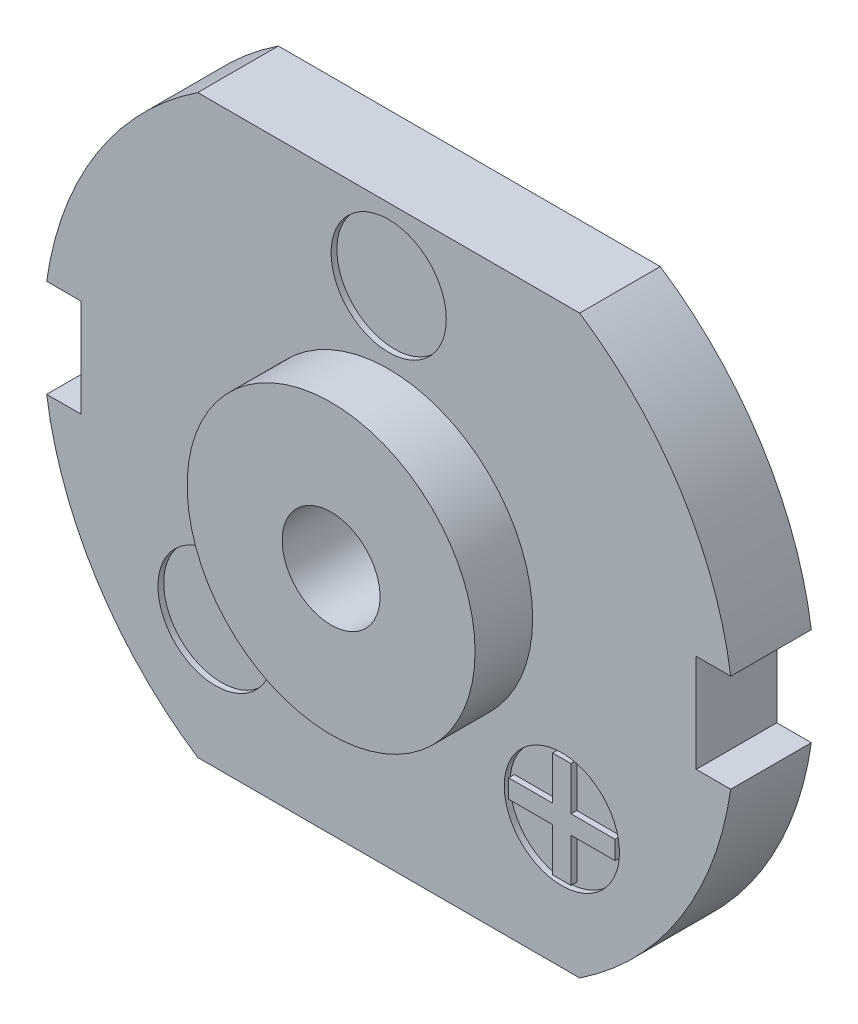
ISO-10303-21;
HEADER;
FILE_DESCRIPTION(('STEP AP214'),'2;1');
FILE_NAME('part.step','',(''),(''),'','','');
FILE_SCHEMA(('AUTOMOTIVE_DESIGN { 1 0 10303 214 1 1 1 1 }'));
ENDSEC;
DATA;
#1=APPLICATION_CONTEXT('core data for automotive mechanical design processes');
#2=APPLICATION_PROTOCOL_DEFINITION('international standard','automotive_design',2000,#1);
#3=PRODUCT_CONTEXT('',#1,'mechanical');
#4=PRODUCT('Part','Part','',(#3));
#5=PRODUCT_RELATED_PRODUCT_CATEGORY('part','',(#4));
#6=PRODUCT_DEFINITION_FORMATION('','',#4);
#7=PRODUCT_DEFINITION_CONTEXT('part definition',#1,'design');
#8=PRODUCT_DEFINITION('design','',#6,#7);
#9=PRODUCT_DEFINITION_SHAPE('','',#8);
#10=(LENGTH_UNIT() NAMED_UNIT(*) SI_UNIT(.MILLI.,.METRE.));
#11=(NAMED_UNIT(*) PLANE_ANGLE_UNIT() SI_UNIT($,.RADIAN.));
#12=(NAMED_UNIT(*) SI_UNIT($,.STERADIAN.) SOLID_ANGLE_UNIT());
#13=UNCERTAINTY_MEASURE_WITH_UNIT(LENGTH_MEASURE(1.E-05),#10,'distance_accuracy_value','');
#14=(GEOMETRIC_REPRESENTATION_CONTEXT(3) GLOBAL_UNCERTAINTY_ASSIGNED_CONTEXT((#13)) GLOBAL_UNIT_ASSIGNED_CONTEXT((#10,
#11,#12)) REPRESENTATION_CONTEXT('',''));
#15=CARTESIAN_POINT('',(0.,0.,0.));
#16=DIRECTION('',(0.,0.,1.));
#17=DIRECTION('',(1.,0.,0.));
#18=AXIS2_PLACEMENT_3D('',#15,#16,#17);
#19=CARTESIAN_POINT('',(0.,0.,1.4));
#20=DIRECTION('',(0.,0.,1.));
#21=DIRECTION('',(1.,0.,0.));
#22=AXIS2_PLACEMENT_3D('',#19,#20,#21);
#23=PLANE('',#22);
#24=CARTESIAN_POINT('',(0.,3.75,1.4));
#25=DIRECTION('',(0.,0.,1.));
#26=DIRECTION('',(1.,0.,0.));
#27=AXIS2_PLACEMENT_3D('',#24,#25,#26);
#28=CIRCLE('',#27,1.);
#29=CARTESIAN_POINT('',(1.,3.75,1.4));
#30=VERTEX_POINT('',#29);
#31=EDGE_CURVE('E388',#30,#30,#28,.T.);
#32=ORIENTED_EDGE('',*,*,#31,.F.);
#33=EDGE_LOOP('',(#32));
#34=FACE_BOUND('',#33,.T.);
#35=CARTESIAN_POINT('',(3.00665339511067,-2.76689870627636,1.4));
#36=DIRECTION('',(0.,0.,1.));
#37=DIRECTION('',(-1.,0.,0.));
#38=AXIS2_PLACEMENT_3D('',#35,#36,#37);
#39=CIRCLE('',#38,1.);
#40=CARTESIAN_POINT('',(2.00665339511067,-2.76689870627636,1.4));
#41=VERTEX_POINT('',#40);
#42=EDGE_CURVE('E278',#41,#41,#39,.T.);
#43=ORIENTED_EDGE('',*,*,#42,.F.);
#44=EDGE_LOOP('',(#43));
#45=FACE_BOUND('',#44,.T.);
#46=CARTESIAN_POINT('',(-3.00665339511067,-2.76689870627636,1.4));
#47=DIRECTION('',(0.,0.,1.));
#48=DIRECTION('',(1.,0.,0.));
#49=AXIS2_PLACEMENT_3D('',#46,#47,#48);
#50=CIRCLE('',#49,1.);
#51=CARTESIAN_POINT('',(-2.00665339511067,-2.76689870627636,1.4));
#52=VERTEX_POINT('',#51);
#53=EDGE_CURVE('E272',#52,#52,#50,.T.);
#54=ORIENTED_EDGE('',*,*,#53,.F.);
#55=EDGE_LOOP('',(#54));
#56=FACE_BOUND('',#55,.T.);
#57=CARTESIAN_POINT('',(0.,0.,1.4));
#58=DIRECTION('',(0.,0.,1.));
#59=DIRECTION('',(1.,0.,0.));
#60=AXIS2_PLACEMENT_3D('',#57,#58,#59);
#61=CIRCLE('',#60,6.);
#62=CARTESIAN_POINT('',(-5.9394865097919,-0.850000000000001,1.4));
#63=VERTEX_POINT('',#62);
#64=CARTESIAN_POINT('',(-3.31662479035541,-5.,1.4));
#65=VERTEX_POINT('',#64);
#66=EDGE_CURVE('E188',#63,#65,#61,.T.);
#67=ORIENTED_EDGE('',*,*,#66,.T.);
#68=DIRECTION('',(1.,0.,0.));
#69=VECTOR('',#68,1.);
#70=CARTESIAN_POINT('',(-3.31662479035541,-5.,1.4));
#71=LINE('',#70,#69);
#72=CARTESIAN_POINT('',(3.3166247903554,-5.,1.4));
#73=VERTEX_POINT('',#72);
#74=EDGE_CURVE('E109',#65,#73,#71,.T.);
#75=ORIENTED_EDGE('',*,*,#74,.T.);
#76=CARTESIAN_POINT('',(0.,0.,1.4));
#77=DIRECTION('',(0.,0.,1.));
#78=DIRECTION('',(1.,0.,0.));
#79=AXIS2_PLACEMENT_3D('',#76,#77,#78);
#80=CIRCLE('',#79,6.);
#81=CARTESIAN_POINT('',(5.93948650979191,-0.849999999999999,1.4));
#82=VERTEX_POINT('',#81);
#83=EDGE_CURVE('E215',#73,#82,#80,.T.);
#84=ORIENTED_EDGE('',*,*,#83,.T.);
#85=DIRECTION('',(-1.,0.,0.));
#86=VECTOR('',#85,1.);
#87=CARTESIAN_POINT('',(5.93948650979191,-0.849999999999999,1.4));
#88=LINE('',#87,#86);
#89=CARTESIAN_POINT('',(5.3404104146324,-0.849999999999999,1.4));
#90=VERTEX_POINT('',#89);
#91=EDGE_CURVE('E234',#82,#90,#88,.T.);
#92=ORIENTED_EDGE('',*,*,#91,.T.);
#93=DIRECTION('',(0.,1.,0.));
#94=VECTOR('',#93,1.);
#95=CARTESIAN_POINT('',(5.3404104146324,-0.849999999999999,1.4));
#96=LINE('',#95,#94);
#97=CARTESIAN_POINT('',(5.3404104146324,0.849999999999999,1.4));
#98=VERTEX_POINT('',#97);
#99=EDGE_CURVE('E231',#90,#98,#96,.T.);
#100=ORIENTED_EDGE('',*,*,#99,.T.);
#101=DIRECTION('',(1.,0.,0.));
#102=VECTOR('',#101,1.);
#103=CARTESIAN_POINT('',(5.93948650979191,0.85,1.4));
#104=LINE('',#103,#102);
#105=CARTESIAN_POINT('',(5.93948650979191,0.85,1.4));
#106=VERTEX_POINT('',#105);
#107=EDGE_CURVE('E233',#98,#106,#104,.T.);
#108=ORIENTED_EDGE('',*,*,#107,.T.);
#109=CARTESIAN_POINT('',(0.,0.,1.4));
#110=DIRECTION('',(0.,0.,1.));
#111=DIRECTION('',(1.,0.,0.));
#112=AXIS2_PLACEMENT_3D('',#109,#110,#111);
#113=CIRCLE('',#112,6.);
#114=CARTESIAN_POINT('',(3.3166247903554,5.,1.4));
#115=VERTEX_POINT('',#114);
#116=EDGE_CURVE('E236',#106,#115,#113,.T.);
#117=ORIENTED_EDGE('',*,*,#116,.T.);
#118=DIRECTION('',(-1.,0.,0.));
#119=VECTOR('',#118,1.);
#120=CARTESIAN_POINT('',(3.3166247903554,5.,1.4));
#121=LINE('',#120,#119);
#122=CARTESIAN_POINT('',(-3.3166247903554,5.,1.4));
#123=VERTEX_POINT('',#122);
#124=EDGE_CURVE('E242',#115,#123,#121,.T.);
#125=ORIENTED_EDGE('',*,*,#124,.T.);
#126=CARTESIAN_POINT('',(0.,0.,1.4));
#127=DIRECTION('',(0.,0.,1.));
#128=DIRECTION('',(1.,0.,0.));
#129=AXIS2_PLACEMENT_3D('',#126,#127,#128);
#130=CIRCLE('',#129,6.);
#131=CARTESIAN_POINT('',(-5.9394865097919,0.849999999999999,1.4));
#132=VERTEX_POINT('',#131);
#133=EDGE_CURVE('E143',#123,#132,#130,.T.);
#134=ORIENTED_EDGE('',*,*,#133,.T.);
#135=DIRECTION('',(1.,0.,0.));
#136=VECTOR('',#135,1.);
#137=CARTESIAN_POINT('',(-5.3404104146324,0.849999999999999,1.4));
#138=LINE('',#137,#136);
#139=CARTESIAN_POINT('',(-5.3404104146324,0.849999999999999,1.4));
#140=VERTEX_POINT('',#139);
#141=EDGE_CURVE('E136',#132,#140,#138,.T.);
#142=ORIENTED_EDGE('',*,*,#141,.T.);
#143=DIRECTION('',(0.,-1.,0.));
#144=VECTOR('',#143,1.);
#145=CARTESIAN_POINT('',(-5.3404104146324,-0.849999999999999,1.4));
#146=LINE('',#145,#144);
#147=CARTESIAN_POINT('',(-5.3404104146324,-0.849999999999999,1.4));
#148=VERTEX_POINT('',#147);
#149=EDGE_CURVE('E140',#140,#148,#146,.T.);
#150=ORIENTED_EDGE('',*,*,#149,.T.);
#151=DIRECTION('',(-1.,0.,0.));
#152=VECTOR('',#151,1.);
#153=CARTESIAN_POINT('',(-5.3404104146324,-0.849999999999999,1.4));
#154=LINE('',#153,#152);
#155=EDGE_CURVE('E56',#148,#63,#154,.T.);
#156=ORIENTED_EDGE('',*,*,#155,.T.);
#157=EDGE_LOOP('',(#67,#75,#84,#92,#100,#108,#117,#125,#134,#142,#150,#156));
#158=FACE_BOUND('',#157,.T.);
#159=CARTESIAN_POINT('',(0.,0.,1.4));
#160=DIRECTION('',(0.,0.,1.));
#161=DIRECTION('',(1.,0.,0.));
#162=AXIS2_PLACEMENT_3D('',#159,#160,#161);
#163=CIRCLE('',#162,2.5);
#164=CARTESIAN_POINT('',(2.5,0.,1.4));
#165=VERTEX_POINT('',#164);
#166=EDGE_CURVE('E263',#165,#165,#163,.T.);
#167=ORIENTED_EDGE('',*,*,#166,.F.);
#168=EDGE_LOOP('',(#167));
#169=FACE_BOUND('',#168,.T.);
#170=ADVANCED_FACE('F32',(#34,#45,#56,#158,#169),#23,.T.);
#171=CARTESIAN_POINT('',(0.,0.,0.));
#172=DIRECTION('',(0.,0.,1.));
#173=DIRECTION('',(1.,0.,0.));
#174=AXIS2_PLACEMENT_3D('',#171,#172,#173);
#175=PLANE('',#174);
#176=CARTESIAN_POINT('',(0.,0.,0.));
#177=DIRECTION('',(0.,0.,1.));
#178=DIRECTION('',(1.,0.,0.));
#179=AXIS2_PLACEMENT_3D('',#176,#177,#178);
#180=CIRCLE('',#179,6.);
#181=CARTESIAN_POINT('',(-5.9394865097919,-0.850000000000001,0.));
#182=VERTEX_POINT('',#181);
#183=CARTESIAN_POINT('',(-3.31662479035541,-5.,0.));
#184=VERTEX_POINT('',#183);
#185=EDGE_CURVE('E164',#182,#184,#180,.T.);
#186=ORIENTED_EDGE('',*,*,#185,.F.);
#187=DIRECTION('',(-1.,0.,0.));
#188=VECTOR('',#187,1.);
#189=CARTESIAN_POINT('',(-5.3404104146324,-0.849999999999999,0.));
#190=LINE('',#189,#188);
#191=CARTESIAN_POINT('',(-5.3404104146324,-0.849999999999999,0.));
#192=VERTEX_POINT('',#191);
#193=EDGE_CURVE('E101',#192,#182,#190,.T.);
#194=ORIENTED_EDGE('',*,*,#193,.F.);
#195=DIRECTION('',(0.,-1.,0.));
#196=VECTOR('',#195,1.);
#197=CARTESIAN_POINT('',(-5.3404104146324,-0.849999999999999,0.));
#198=LINE('',#197,#196);
#199=CARTESIAN_POINT('',(-5.3404104146324,0.849999999999999,0.));
#200=VERTEX_POINT('',#199);
#201=EDGE_CURVE('E185',#200,#192,#198,.T.);
#202=ORIENTED_EDGE('',*,*,#201,.F.);
#203=DIRECTION('',(1.,0.,0.));
#204=VECTOR('',#203,1.);
#205=CARTESIAN_POINT('',(-5.3404104146324,0.849999999999999,0.));
#206=LINE('',#205,#204);
#207=CARTESIAN_POINT('',(-5.9394865097919,0.849999999999999,0.));
#208=VERTEX_POINT('',#207);
#209=EDGE_CURVE('E152',#208,#200,#206,.T.);
#210=ORIENTED_EDGE('',*,*,#209,.F.);
#211=CARTESIAN_POINT('',(0.,0.,0.));
#212=DIRECTION('',(0.,0.,1.));
#213=DIRECTION('',(1.,0.,0.));
#214=AXIS2_PLACEMENT_3D('',#211,#212,#213);
#215=CIRCLE('',#214,6.);
#216=CARTESIAN_POINT('',(-3.3166247903554,5.,0.));
#217=VERTEX_POINT('',#216);
#218=EDGE_CURVE('E182',#217,#208,#215,.T.);
#219=ORIENTED_EDGE('',*,*,#218,.F.);
#220=DIRECTION('',(-1.,0.,0.));
#221=VECTOR('',#220,1.);
#222=CARTESIAN_POINT('',(3.3166247903554,5.,0.));
#223=LINE('',#222,#221);
#224=CARTESIAN_POINT('',(3.3166247903554,5.,0.));
#225=VERTEX_POINT('',#224);
#226=EDGE_CURVE('E180',#225,#217,#223,.T.);
#227=ORIENTED_EDGE('',*,*,#226,.F.);
#228=CARTESIAN_POINT('',(0.,0.,0.));
#229=DIRECTION('',(0.,0.,1.));
#230=DIRECTION('',(1.,0.,0.));
#231=AXIS2_PLACEMENT_3D('',#228,#229,#230);
#232=CIRCLE('',#231,6.);
#233=CARTESIAN_POINT('',(5.93948650979191,0.85,0.));
#234=VERTEX_POINT('',#233);
#235=EDGE_CURVE('E178',#234,#225,#232,.T.);
#236=ORIENTED_EDGE('',*,*,#235,.F.);
#237=DIRECTION('',(1.,0.,0.));
#238=VECTOR('',#237,1.);
#239=CARTESIAN_POINT('',(5.93948650979191,0.85,0.));
#240=LINE('',#239,#238);
#241=CARTESIAN_POINT('',(5.3404104146324,0.849999999999999,0.));
#242=VERTEX_POINT('',#241);
#243=EDGE_CURVE('E176',#242,#234,#240,.T.);
#244=ORIENTED_EDGE('',*,*,#243,.F.);
#245=DIRECTION('',(0.,1.,0.));
#246=VECTOR('',#245,1.);
#247=CARTESIAN_POINT('',(5.3404104146324,-0.849999999999999,0.));
#248=LINE('',#247,#246);
#249=CARTESIAN_POINT('',(5.3404104146324,-0.849999999999999,0.));
#250=VERTEX_POINT('',#249);
#251=EDGE_CURVE('E174',#250,#242,#248,.T.);
#252=ORIENTED_EDGE('',*,*,#251,.F.);
#253=DIRECTION('',(-1.,0.,0.));
#254=VECTOR('',#253,1.);
#255=CARTESIAN_POINT('',(5.93948650979191,-0.849999999999999,0.));
#256=LINE('',#255,#254);
#257=CARTESIAN_POINT('',(5.93948650979191,-0.849999999999999,0.));
#258=VERTEX_POINT('',#257);
#259=EDGE_CURVE('E172',#258,#250,#256,.T.);
#260=ORIENTED_EDGE('',*,*,#259,.F.);
#261=CARTESIAN_POINT('',(0.,0.,0.));
#262=DIRECTION('',(0.,0.,1.));
#263=DIRECTION('',(1.,0.,0.));
#264=AXIS2_PLACEMENT_3D('',#261,#262,#263);
#265=CIRCLE('',#264,6.);
#266=CARTESIAN_POINT('',(3.3166247903554,-5.,0.));
#267=VERTEX_POINT('',#266);
#268=EDGE_CURVE('E170',#267,#258,#265,.T.);
#269=ORIENTED_EDGE('',*,*,#268,.F.);
#270=DIRECTION('',(1.,0.,0.));
#271=VECTOR('',#270,1.);
#272=CARTESIAN_POINT('',(-3.31662479035541,-5.,0.));
#273=LINE('',#272,#271);
#274=EDGE_CURVE('E167',#184,#267,#273,.T.);
#275=ORIENTED_EDGE('',*,*,#274,.F.);
#276=EDGE_LOOP('',(#186,#194,#202,#210,#219,#227,#236,#244,#252,#260,#269,#275));
#277=FACE_BOUND('',#276,.T.);
#278=CARTESIAN_POINT('',(0.,0.,0.));
#279=DIRECTION('',(0.,0.,1.));
#280=DIRECTION('',(1.,0.,0.));
#281=AXIS2_PLACEMENT_3D('',#278,#279,#280);
#282=CIRCLE('',#281,0.85);
#283=CARTESIAN_POINT('',(0.85,0.,0.));
#284=VERTEX_POINT('',#283);
#285=EDGE_CURVE('E168',#284,#284,#282,.T.);
#286=ORIENTED_EDGE('',*,*,#285,.T.);
#287=EDGE_LOOP('',(#286));
#288=FACE_BOUND('',#287,.T.);
#289=ADVANCED_FACE('F219',(#277,#288),#175,.F.);
#290=CARTESIAN_POINT('',(0.,0.,1.4));
#291=DIRECTION('',(0.,0.,-1.));
#292=DIRECTION('',(-1.,0.,0.));
#293=AXIS2_PLACEMENT_3D('',#290,#291,#292);
#294=CYLINDRICAL_SURFACE('',#293,6.);
#295=ORIENTED_EDGE('',*,*,#185,.T.);
#296=DIRECTION('',(0.,0.,-1.));
#297=VECTOR('',#296,1.);
#298=CARTESIAN_POINT('',(-3.31662479035541,-5.,1.4));
#299=LINE('',#298,#297);
#300=EDGE_CURVE('E11',#65,#184,#299,.T.);
#301=ORIENTED_EDGE('',*,*,#300,.F.);
#302=ORIENTED_EDGE('',*,*,#66,.F.);
#303=DIRECTION('',(0.,0.,-1.));
#304=VECTOR('',#303,1.);
#305=CARTESIAN_POINT('',(-5.9394865097919,-0.850000000000001,1.4));
#306=LINE('',#305,#304);
#307=EDGE_CURVE('E160',#63,#182,#306,.T.);
#308=ORIENTED_EDGE('',*,*,#307,.T.);
#309=EDGE_LOOP('',(#295,#301,#302,#308));
#310=FACE_BOUND('',#309,.T.);
#311=ADVANCED_FACE('F34',(#310),#294,.T.);
#312=CARTESIAN_POINT('',(-3.31662479035541,-5.,1.4));
#313=DIRECTION('',(0.,1.,0.));
#314=DIRECTION('',(-1.,0.,0.));
#315=AXIS2_PLACEMENT_3D('',#312,#313,#314);
#316=PLANE('',#315);
#317=ORIENTED_EDGE('',*,*,#274,.T.);
#318=DIRECTION('',(0.,0.,-1.));
#319=VECTOR('',#318,1.);
#320=CARTESIAN_POINT('',(3.3166247903554,-5.,1.4));
#321=LINE('',#320,#319);
#322=EDGE_CURVE('E40',#73,#267,#321,.T.);
#323=ORIENTED_EDGE('',*,*,#322,.F.);
#324=ORIENTED_EDGE('',*,*,#74,.F.);
#325=ORIENTED_EDGE('',*,*,#300,.T.);
#326=EDGE_LOOP('',(#317,#323,#324,#325));
#327=FACE_BOUND('',#326,.T.);
#328=ADVANCED_FACE('F461',(#327),#316,.F.);
#329=CARTESIAN_POINT('',(0.,0.,1.4));
#330=DIRECTION('',(0.,0.,-1.));
#331=DIRECTION('',(-1.,0.,0.));
#332=AXIS2_PLACEMENT_3D('',#329,#330,#331);
#333=CYLINDRICAL_SURFACE('',#332,6.);
#334=ORIENTED_EDGE('',*,*,#268,.T.);
#335=DIRECTION('',(0.,0.,-1.));
#336=VECTOR('',#335,1.);
#337=CARTESIAN_POINT('',(5.93948650979191,-0.849999999999999,1.4));
#338=LINE('',#337,#336);
#339=EDGE_CURVE('E207',#82,#258,#338,.T.);
#340=ORIENTED_EDGE('',*,*,#339,.F.);
#341=ORIENTED_EDGE('',*,*,#83,.F.);
#342=ORIENTED_EDGE('',*,*,#322,.T.);
#343=EDGE_LOOP('',(#334,#340,#341,#342));
#344=FACE_BOUND('',#343,.T.);
#345=ADVANCED_FACE('F213',(#344),#333,.T.);
#346=CARTESIAN_POINT('',(5.93948650979191,-0.849999999999999,1.4));
#347=DIRECTION('',(0.,-1.,0.));
#348=DIRECTION('',(1.,0.,0.));
#349=AXIS2_PLACEMENT_3D('',#346,#347,#348);
#350=PLANE('',#349);
#351=ORIENTED_EDGE('',*,*,#259,.T.);
#352=DIRECTION('',(0.,0.,-1.));
#353=VECTOR('',#352,1.);
#354=CARTESIAN_POINT('',(5.3404104146324,-0.849999999999999,1.4));
#355=LINE('',#354,#353);
#356=EDGE_CURVE('E204',#90,#250,#355,.T.);
#357=ORIENTED_EDGE('',*,*,#356,.F.);
#358=ORIENTED_EDGE('',*,*,#91,.F.);
#359=ORIENTED_EDGE('',*,*,#339,.T.);
#360=EDGE_LOOP('',(#351,#357,#358,#359));
#361=FACE_BOUND('',#360,.T.);
#362=ADVANCED_FACE('F225',(#361),#350,.F.);
#363=CARTESIAN_POINT('',(5.3404104146324,-0.849999999999999,1.4));
#364=DIRECTION('',(-1.,0.,0.));
#365=DIRECTION('',(0.,0.,1.));
#366=AXIS2_PLACEMENT_3D('',#363,#364,#365);
#367=PLANE('',#366);
#368=ORIENTED_EDGE('',*,*,#251,.T.);
#369=DIRECTION('',(0.,0.,-1.));
#370=VECTOR('',#369,1.);
#371=CARTESIAN_POINT('',(5.3404104146324,0.849999999999999,1.4));
#372=LINE('',#371,#370);
#373=EDGE_CURVE('E201',#98,#242,#372,.T.);
#374=ORIENTED_EDGE('',*,*,#373,.F.);
#375=ORIENTED_EDGE('',*,*,#99,.F.);
#376=ORIENTED_EDGE('',*,*,#356,.T.);
#377=EDGE_LOOP('',(#368,#374,#375,#376));
#378=FACE_BOUND('',#377,.T.);
#379=ADVANCED_FACE('F229',(#378),#367,.F.);
#380=CARTESIAN_POINT('',(5.93948650979191,0.85,1.4));
#381=DIRECTION('',(0.,1.,0.));
#382=DIRECTION('',(-1.,0.,0.));
#383=AXIS2_PLACEMENT_3D('',#380,#381,#382);
#384=PLANE('',#383);
#385=ORIENTED_EDGE('',*,*,#243,.T.);
#386=DIRECTION('',(0.,0.,-1.));
#387=VECTOR('',#386,1.);
#388=CARTESIAN_POINT('',(5.93948650979191,0.85,1.4));
#389=LINE('',#388,#387);
#390=EDGE_CURVE('E198',#106,#234,#389,.T.);
#391=ORIENTED_EDGE('',*,*,#390,.F.);
#392=ORIENTED_EDGE('',*,*,#107,.F.);
#393=ORIENTED_EDGE('',*,*,#373,.T.);
#394=EDGE_LOOP('',(#385,#391,#392,#393));
#395=FACE_BOUND('',#394,.T.);
#396=ADVANCED_FACE('F451',(#395),#384,.F.);
#397=CARTESIAN_POINT('',(0.,0.,1.4));
#398=DIRECTION('',(0.,0.,-1.));
#399=DIRECTION('',(-1.,0.,0.));
#400=AXIS2_PLACEMENT_3D('',#397,#398,#399);
#401=CYLINDRICAL_SURFACE('',#400,6.);
#402=ORIENTED_EDGE('',*,*,#235,.T.);
#403=DIRECTION('',(0.,0.,-1.));
#404=VECTOR('',#403,1.);
#405=CARTESIAN_POINT('',(3.3166247903554,5.,1.4));
#406=LINE('',#405,#404);
#407=EDGE_CURVE('E195',#115,#225,#406,.T.);
#408=ORIENTED_EDGE('',*,*,#407,.F.);
#409=ORIENTED_EDGE('',*,*,#116,.F.);
#410=ORIENTED_EDGE('',*,*,#390,.T.);
#411=EDGE_LOOP('',(#402,#408,#409,#410));
#412=FACE_BOUND('',#411,.T.);
#413=ADVANCED_FACE('F448',(#412),#401,.T.);
#414=CARTESIAN_POINT('',(3.3166247903554,5.,1.4));
#415=DIRECTION('',(0.,-1.,0.));
#416=DIRECTION('',(1.,0.,0.));
#417=AXIS2_PLACEMENT_3D('',#414,#415,#416);
#418=PLANE('',#417);
#419=ORIENTED_EDGE('',*,*,#226,.T.);
#420=DIRECTION('',(0.,0.,-1.));
#421=VECTOR('',#420,1.);
#422=CARTESIAN_POINT('',(-3.3166247903554,5.,1.4));
#423=LINE('',#422,#421);
#424=EDGE_CURVE('E192',#123,#217,#423,.T.);
#425=ORIENTED_EDGE('',*,*,#424,.F.);
#426=ORIENTED_EDGE('',*,*,#124,.F.);
#427=ORIENTED_EDGE('',*,*,#407,.T.);
#428=EDGE_LOOP('',(#419,#425,#426,#427));
#429=FACE_BOUND('',#428,.T.);
#430=ADVANCED_FACE('F248',(#429),#418,.F.);
#431=CARTESIAN_POINT('',(0.,0.,1.4));
#432=DIRECTION('',(0.,0.,-1.));
#433=DIRECTION('',(-1.,0.,0.));
#434=AXIS2_PLACEMENT_3D('',#431,#432,#433);
#435=CYLINDRICAL_SURFACE('',#434,6.);
#436=ORIENTED_EDGE('',*,*,#218,.T.);
#437=DIRECTION('',(0.,0.,-1.));
#438=VECTOR('',#437,1.);
#439=CARTESIAN_POINT('',(-5.9394865097919,0.849999999999999,1.4));
#440=LINE('',#439,#438);
#441=EDGE_CURVE('E155',#132,#208,#440,.T.);
#442=ORIENTED_EDGE('',*,*,#441,.F.);
#443=ORIENTED_EDGE('',*,*,#133,.F.);
#444=ORIENTED_EDGE('',*,*,#424,.T.);
#445=EDGE_LOOP('',(#436,#442,#443,#444));
#446=FACE_BOUND('',#445,.T.);
#447=ADVANCED_FACE('F252',(#446),#435,.T.);
#448=CARTESIAN_POINT('',(-5.3404104146324,0.849999999999999,1.4));
#449=DIRECTION('',(0.,1.,0.));
#450=DIRECTION('',(-1.,0.,0.));
#451=AXIS2_PLACEMENT_3D('',#448,#449,#450);
#452=PLANE('',#451);
#453=ORIENTED_EDGE('',*,*,#209,.T.);
#454=DIRECTION('',(0.,0.,-1.));
#455=VECTOR('',#454,1.);
#456=CARTESIAN_POINT('',(-5.3404104146324,0.849999999999999,1.4));
#457=LINE('',#456,#455);
#458=EDGE_CURVE('E149',#140,#200,#457,.T.);
#459=ORIENTED_EDGE('',*,*,#458,.F.);
#460=ORIENTED_EDGE('',*,*,#141,.F.);
#461=ORIENTED_EDGE('',*,*,#441,.T.);
#462=EDGE_LOOP('',(#453,#459,#460,#461));
#463=FACE_BOUND('',#462,.T.);
#464=ADVANCED_FACE('F150',(#463),#452,.F.);
#465=CARTESIAN_POINT('',(-5.3404104146324,-0.849999999999999,1.4));
#466=DIRECTION('',(1.,0.,0.));
#467=DIRECTION('',(0.,0.,-1.));
#468=AXIS2_PLACEMENT_3D('',#465,#466,#467);
#469=PLANE('',#468);
#470=ORIENTED_EDGE('',*,*,#201,.T.);
#471=DIRECTION('',(0.,0.,-1.));
#472=VECTOR('',#471,1.);
#473=CARTESIAN_POINT('',(-5.3404104146324,-0.849999999999999,1.4));
#474=LINE('',#473,#472);
#475=EDGE_CURVE('E156',#148,#192,#474,.T.);
#476=ORIENTED_EDGE('',*,*,#475,.F.);
#477=ORIENTED_EDGE('',*,*,#149,.F.);
#478=ORIENTED_EDGE('',*,*,#458,.T.);
#479=EDGE_LOOP('',(#470,#476,#477,#478));
#480=FACE_BOUND('',#479,.T.);
#481=ADVANCED_FACE('F158',(#480),#469,.F.);
#482=CARTESIAN_POINT('',(-5.3404104146324,-0.849999999999999,1.4));
#483=DIRECTION('',(0.,-1.,0.));
#484=DIRECTION('',(1.,0.,0.));
#485=AXIS2_PLACEMENT_3D('',#482,#483,#484);
#486=PLANE('',#485);
#487=ORIENTED_EDGE('',*,*,#193,.T.);
#488=ORIENTED_EDGE('',*,*,#307,.F.);
#489=ORIENTED_EDGE('',*,*,#155,.F.);
#490=ORIENTED_EDGE('',*,*,#475,.T.);
#491=EDGE_LOOP('',(#487,#488,#489,#490));
#492=FACE_BOUND('',#491,.T.);
#493=ADVANCED_FACE('F253',(#492),#486,.F.);
#494=CARTESIAN_POINT('',(0.,0.,1.4));
#495=DIRECTION('',(0.,0.,-1.));
#496=DIRECTION('',(-1.,0.,0.));
#497=AXIS2_PLACEMENT_3D('',#494,#495,#496);
#498=CYLINDRICAL_SURFACE('',#497,0.85);
#499=ORIENTED_EDGE('',*,*,#285,.F.);
#500=EDGE_LOOP('',(#499));
#501=FACE_BOUND('',#500,.T.);
#502=CARTESIAN_POINT('',(0.,0.,2.4));
#503=DIRECTION('',(0.,0.,1.));
#504=DIRECTION('',(1.,0.,0.));
#505=AXIS2_PLACEMENT_3D('',#502,#503,#504);
#506=CIRCLE('',#505,0.85);
#507=CARTESIAN_POINT('',(0.85,0.,2.4));
#508=VERTEX_POINT('',#507);
#509=EDGE_CURVE('E266',#508,#508,#506,.T.);
#510=ORIENTED_EDGE('',*,*,#509,.T.);
#511=EDGE_LOOP('',(#510));
#512=FACE_BOUND('',#511,.T.);
#513=ADVANCED_FACE('F430',(#501,#512),#498,.F.);
#514=CARTESIAN_POINT('',(0.,0.,2.4));
#515=DIRECTION('',(0.,0.,1.));
#516=DIRECTION('',(1.,0.,0.));
#517=AXIS2_PLACEMENT_3D('',#514,#515,#516);
#518=PLANE('',#517);
#519=CARTESIAN_POINT('',(0.,0.,2.4));
#520=DIRECTION('',(0.,0.,1.));
#521=DIRECTION('',(1.,0.,0.));
#522=AXIS2_PLACEMENT_3D('',#519,#520,#521);
#523=CIRCLE('',#522,2.5);
#524=CARTESIAN_POINT('',(2.5,0.,2.4));
#525=VERTEX_POINT('',#524);
#526=EDGE_CURVE('E262',#525,#525,#523,.T.);
#527=ORIENTED_EDGE('',*,*,#526,.T.);
#528=EDGE_LOOP('',(#527));
#529=FACE_BOUND('',#528,.T.);
#530=ORIENTED_EDGE('',*,*,#509,.F.);
#531=EDGE_LOOP('',(#530));
#532=FACE_BOUND('',#531,.T.);
#533=ADVANCED_FACE('F423',(#529,#532),#518,.T.);
#534=CARTESIAN_POINT('',(0.,0.,2.4));
#535=DIRECTION('',(0.,0.,-1.));
#536=DIRECTION('',(-1.,0.,0.));
#537=AXIS2_PLACEMENT_3D('',#534,#535,#536);
#538=CYLINDRICAL_SURFACE('',#537,2.5);
#539=ORIENTED_EDGE('',*,*,#526,.F.);
#540=EDGE_LOOP('',(#539));
#541=FACE_BOUND('',#540,.T.);
#542=ORIENTED_EDGE('',*,*,#166,.T.);
#543=EDGE_LOOP('',(#542));
#544=FACE_BOUND('',#543,.T.);
#545=ADVANCED_FACE('F413',(#541,#544),#538,.T.);
#546=CARTESIAN_POINT('',(-3.00665339511067,-2.76689870627636,1.3));
#547=DIRECTION('',(0.,0.,1.));
#548=DIRECTION('',(1.,0.,0.));
#549=AXIS2_PLACEMENT_3D('',#546,#547,#548);
#550=CYLINDRICAL_SURFACE('',#549,1.);
#551=CARTESIAN_POINT('',(-3.00665339511067,-2.76689870627636,1.3));
#552=DIRECTION('',(0.,0.,1.));
#553=DIRECTION('',(1.,0.,0.));
#554=AXIS2_PLACEMENT_3D('',#551,#552,#553);
#555=CIRCLE('',#554,1.);
#556=CARTESIAN_POINT('',(-2.00665339511067,-2.76689870627636,1.3));
#557=VERTEX_POINT('',#556);
#558=EDGE_CURVE('E271',#557,#557,#555,.T.);
#559=ORIENTED_EDGE('',*,*,#558,.F.);
#560=EDGE_LOOP('',(#559));
#561=FACE_BOUND('',#560,.T.);
#562=ORIENTED_EDGE('',*,*,#53,.T.);
#563=EDGE_LOOP('',(#562));
#564=FACE_BOUND('',#563,.T.);
#565=ADVANCED_FACE('F410',(#561,#564),#550,.F.);
#566=CARTESIAN_POINT('',(-3.00665339511067,-2.76689870627636,1.3));
#567=DIRECTION('',(0.,0.,1.));
#568=DIRECTION('',(1.,0.,0.));
#569=AXIS2_PLACEMENT_3D('',#566,#567,#568);
#570=PLANE('',#569);
#571=ORIENTED_EDGE('',*,*,#558,.T.);
#572=EDGE_LOOP('',(#571));
#573=FACE_BOUND('',#572,.T.);
#574=ADVANCED_FACE('F412',(#573),#570,.T.);
#575=CARTESIAN_POINT('',(3.00665339511067,-2.76689870627636,1.3));
#576=DIRECTION('',(0.,0.,1.));
#577=DIRECTION('',(1.,0.,0.));
#578=AXIS2_PLACEMENT_3D('',#575,#576,#577);
#579=CYLINDRICAL_SURFACE('',#578,1.);
#580=CARTESIAN_POINT('',(3.00665339511067,-2.76689870627636,1.3));
#581=DIRECTION('',(0.,0.,1.));
#582=DIRECTION('',(-1.,0.,0.));
#583=AXIS2_PLACEMENT_3D('',#580,#581,#582);
#584=CIRCLE('',#583,1.);
#585=CARTESIAN_POINT('',(2.00665339511067,-2.76689870627636,1.3));
#586=VERTEX_POINT('',#585);
#587=EDGE_CURVE('E275',#586,#586,#584,.T.);
#588=ORIENTED_EDGE('',*,*,#587,.F.);
#589=EDGE_LOOP('',(#588));
#590=FACE_BOUND('',#589,.T.);
#591=ORIENTED_EDGE('',*,*,#42,.T.);
#592=EDGE_LOOP('',(#591));
#593=FACE_BOUND('',#592,.T.);
#594=ADVANCED_FACE('F420',(#590,#593),#579,.F.);
#595=CARTESIAN_POINT('',(3.00665339511067,-2.76689870627636,1.3));
#596=DIRECTION('',(0.,0.,-1.));
#597=DIRECTION('',(-1.,0.,0.));
#598=AXIS2_PLACEMENT_3D('',#595,#596,#597);
#599=PLANE('',#598);
#600=DIRECTION('',(0.,1.,0.));
#601=VECTOR('',#600,1.);
#602=CARTESIAN_POINT('',(3.16628165374625,-2.60599841136822,1.3));
#603=LINE('',#602,#601);
#604=CARTESIAN_POINT('',(3.16628165374625,-2.60599841136822,1.3));
#605=VERTEX_POINT('',#604);
#606=CARTESIAN_POINT('',(3.16628165374625,-1.85039599921935,1.3));
#607=VERTEX_POINT('',#606);
#608=EDGE_CURVE('E321',#605,#607,#603,.T.);
#609=ORIENTED_EDGE('',*,*,#608,.F.);
#610=DIRECTION('',(-1.,0.,0.));
#611=VECTOR('',#610,1.);
#612=CARTESIAN_POINT('',(3.16628165374625,-2.60599841136822,1.3));
#613=LINE('',#612,#611);
#614=CARTESIAN_POINT('',(3.9304594749993,-2.60599841136822,1.3));
#615=VERTEX_POINT('',#614);
#616=EDGE_CURVE('E288',#615,#605,#613,.T.);
#617=ORIENTED_EDGE('',*,*,#616,.F.);
#618=DIRECTION('',(0.,1.,0.));
#619=VECTOR('',#618,1.);
#620=CARTESIAN_POINT('',(3.9304594749993,-2.9277990011845,1.3));
#621=LINE('',#620,#619);
#622=CARTESIAN_POINT('',(3.9304594749993,-2.9277990011845,1.3));
#623=VERTEX_POINT('',#622);
#624=EDGE_CURVE('E356',#623,#615,#621,.T.);
#625=ORIENTED_EDGE('',*,*,#624,.F.);
#626=DIRECTION('',(1.,0.,0.));
#627=VECTOR('',#626,1.);
#628=CARTESIAN_POINT('',(3.16628165374625,-2.9277990011845,1.3));
#629=LINE('',#628,#627);
#630=CARTESIAN_POINT('',(3.16628165374625,-2.9277990011845,1.3));
#631=VERTEX_POINT('',#630);
#632=EDGE_CURVE('E359',#631,#623,#629,.T.);
#633=ORIENTED_EDGE('',*,*,#632,.F.);
#634=DIRECTION('',(0.,1.,0.));
#635=VECTOR('',#634,1.);
#636=CARTESIAN_POINT('',(3.16628165374625,-3.68340141333337,1.3));
#637=LINE('',#636,#635);
#638=CARTESIAN_POINT('',(3.16628165374625,-3.68340141333337,1.3));
#639=VERTEX_POINT('',#638);
#640=EDGE_CURVE('E362',#639,#631,#637,.T.);
#641=ORIENTED_EDGE('',*,*,#640,.F.);
#642=DIRECTION('',(1.,0.,0.));
#643=VECTOR('',#642,1.);
#644=CARTESIAN_POINT('',(2.84702513647508,-3.68340141333337,1.3));
#645=LINE('',#644,#643);
#646=CARTESIAN_POINT('',(2.84702513647508,-3.68340141333337,1.3));
#647=VERTEX_POINT('',#646);
#648=EDGE_CURVE('E365',#647,#639,#645,.T.);
#649=ORIENTED_EDGE('',*,*,#648,.F.);
#650=DIRECTION('',(0.,-1.,0.));
#651=VECTOR('',#650,1.);
#652=CARTESIAN_POINT('',(2.84702513647508,-3.68340141333337,1.3));
#653=LINE('',#652,#651);
#654=CARTESIAN_POINT('',(2.84702513647508,-2.9277990011845,1.3));
#655=VERTEX_POINT('',#654);
#656=EDGE_CURVE('E368',#655,#647,#653,.T.);
#657=ORIENTED_EDGE('',*,*,#656,.F.);
#658=DIRECTION('',(1.,0.,0.));
#659=VECTOR('',#658,1.);
#660=CARTESIAN_POINT('',(2.08284731522203,-2.9277990011845,1.3));
#661=LINE('',#660,#659);
#662=CARTESIAN_POINT('',(2.08284731522203,-2.9277990011845,1.3));
#663=VERTEX_POINT('',#662);
#664=EDGE_CURVE('E371',#663,#655,#661,.T.);
#665=ORIENTED_EDGE('',*,*,#664,.F.);
#666=DIRECTION('',(0.,-1.,0.));
#667=VECTOR('',#666,1.);
#668=CARTESIAN_POINT('',(2.08284731522203,-2.9277990011845,1.3));
#669=LINE('',#668,#667);
#670=CARTESIAN_POINT('',(2.08284731522203,-2.60599841136822,1.3));
#671=VERTEX_POINT('',#670);
#672=EDGE_CURVE('E374',#671,#663,#669,.T.);
#673=ORIENTED_EDGE('',*,*,#672,.F.);
#674=DIRECTION('',(-1.,0.,0.));
#675=VECTOR('',#674,1.);
#676=CARTESIAN_POINT('',(2.08284731522203,-2.60599841136822,1.3));
#677=LINE('',#676,#675);
#678=CARTESIAN_POINT('',(2.84702513647508,-2.60599841136822,1.3));
#679=VERTEX_POINT('',#678);
#680=EDGE_CURVE('E377',#679,#671,#677,.T.);
#681=ORIENTED_EDGE('',*,*,#680,.F.);
#682=DIRECTION('',(0.,-1.,0.));
#683=VECTOR('',#682,1.);
#684=CARTESIAN_POINT('',(2.84702513647508,-2.60599841136822,1.3));
#685=LINE('',#684,#683);
#686=CARTESIAN_POINT('',(2.84702513647508,-1.85039599921935,1.3));
#687=VERTEX_POINT('',#686);
#688=EDGE_CURVE('E380',#687,#679,#685,.T.);
#689=ORIENTED_EDGE('',*,*,#688,.F.);
#690=DIRECTION('',(-1.,0.,0.));
#691=VECTOR('',#690,1.);
#692=CARTESIAN_POINT('',(2.84702513647508,-1.85039599921935,1.3));
#693=LINE('',#692,#691);
#694=EDGE_CURVE('E383',#607,#687,#693,.T.);
#695=ORIENTED_EDGE('',*,*,#694,.F.);
#696=EDGE_LOOP('',(#609,#617,#625,#633,#641,#649,#657,#665,#673,#681,#689,#695));
#697=FACE_BOUND('',#696,.T.);
#698=ORIENTED_EDGE('',*,*,#587,.T.);
#699=EDGE_LOOP('',(#698));
#700=FACE_BOUND('',#699,.T.);
#701=ADVANCED_FACE('F502',(#697,#700),#599,.F.);
#702=CARTESIAN_POINT('',(3.16628165374625,-2.60599841136822,1.3));
#703=DIRECTION('',(1.,0.,0.));
#704=DIRECTION('',(0.,0.,-1.));
#705=AXIS2_PLACEMENT_3D('',#702,#703,#704);
#706=PLANE('',#705);
#707=DIRECTION('',(0.,1.,0.));
#708=VECTOR('',#707,1.);
#709=CARTESIAN_POINT('',(3.16628165374625,-2.60599841136822,1.4));
#710=LINE('',#709,#708);
#711=CARTESIAN_POINT('',(3.16628165374625,-2.60599841136822,1.4));
#712=VERTEX_POINT('',#711);
#713=CARTESIAN_POINT('',(3.16628165374625,-1.85039599921935,1.4));
#714=VERTEX_POINT('',#713);
#715=EDGE_CURVE('E350',#712,#714,#710,.T.);
#716=ORIENTED_EDGE('',*,*,#715,.F.);
#717=DIRECTION('',(0.,0.,1.));
#718=VECTOR('',#717,1.);
#719=CARTESIAN_POINT('',(3.16628165374625,-2.60599841136822,1.3));
#720=LINE('',#719,#718);
#721=EDGE_CURVE('E281',#605,#712,#720,.T.);
#722=ORIENTED_EDGE('',*,*,#721,.F.);
#723=ORIENTED_EDGE('',*,*,#608,.T.);
#724=DIRECTION('',(0.,0.,1.));
#725=VECTOR('',#724,1.);
#726=CARTESIAN_POINT('',(3.16628165374625,-1.85039599921935,1.3));
#727=LINE('',#726,#725);
#728=EDGE_CURVE('E284',#607,#714,#727,.T.);
#729=ORIENTED_EDGE('',*,*,#728,.T.);
#730=EDGE_LOOP('',(#716,#722,#723,#729));
#731=FACE_BOUND('',#730,.T.);
#732=ADVANCED_FACE('F511',(#731),#706,.T.);
#733=CARTESIAN_POINT('',(3.16628165374625,-2.60599841136822,1.3));
#734=DIRECTION('',(0.,1.,0.));
#735=DIRECTION('',(0.,0.,1.));
#736=AXIS2_PLACEMENT_3D('',#733,#734,#735);
#737=PLANE('',#736);
#738=DIRECTION('',(-1.,0.,0.));
#739=VECTOR('',#738,1.);
#740=CARTESIAN_POINT('',(3.16628165374625,-2.60599841136822,1.4));
#741=LINE('',#740,#739);
#742=CARTESIAN_POINT('',(3.9304594749993,-2.60599841136822,1.4));
#743=VERTEX_POINT('',#742);
#744=EDGE_CURVE('E318',#743,#712,#741,.T.);
#745=ORIENTED_EDGE('',*,*,#744,.F.);
#746=DIRECTION('',(0.,0.,1.));
#747=VECTOR('',#746,1.);
#748=CARTESIAN_POINT('',(3.9304594749993,-2.60599841136822,1.3));
#749=LINE('',#748,#747);
#750=EDGE_CURVE('E313',#615,#743,#749,.T.);
#751=ORIENTED_EDGE('',*,*,#750,.F.);
#752=ORIENTED_EDGE('',*,*,#616,.T.);
#753=ORIENTED_EDGE('',*,*,#721,.T.);
#754=EDGE_LOOP('',(#745,#751,#752,#753));
#755=FACE_BOUND('',#754,.T.);
#756=ADVANCED_FACE('F521',(#755),#737,.T.);
#757=CARTESIAN_POINT('',(3.9304594749993,-2.9277990011845,1.3));
#758=DIRECTION('',(1.,0.,0.));
#759=DIRECTION('',(0.,0.,-1.));
#760=AXIS2_PLACEMENT_3D('',#757,#758,#759);
#761=PLANE('',#760);
#762=DIRECTION('',(0.,1.,0.));
#763=VECTOR('',#762,1.);
#764=CARTESIAN_POINT('',(3.9304594749993,-2.9277990011845,1.4));
#765=LINE('',#764,#763);
#766=CARTESIAN_POINT('',(3.9304594749993,-2.9277990011845,1.4));
#767=VERTEX_POINT('',#766);
#768=EDGE_CURVE('E322',#767,#743,#765,.T.);
#769=ORIENTED_EDGE('',*,*,#768,.F.);
#770=DIRECTION('',(0.,0.,1.));
#771=VECTOR('',#770,1.);
#772=CARTESIAN_POINT('',(3.9304594749993,-2.9277990011845,1.3));
#773=LINE('',#772,#771);
#774=EDGE_CURVE('E310',#623,#767,#773,.T.);
#775=ORIENTED_EDGE('',*,*,#774,.F.);
#776=ORIENTED_EDGE('',*,*,#624,.T.);
#777=ORIENTED_EDGE('',*,*,#750,.T.);
#778=EDGE_LOOP('',(#769,#775,#776,#777));
#779=FACE_BOUND('',#778,.T.);
#780=ADVANCED_FACE('F531',(#779),#761,.T.);
#781=CARTESIAN_POINT('',(3.16628165374625,-2.9277990011845,1.3));
#782=DIRECTION('',(0.,-1.,0.));
#783=DIRECTION('',(0.,0.,-1.));
#784=AXIS2_PLACEMENT_3D('',#781,#782,#783);
#785=PLANE('',#784);
#786=DIRECTION('',(1.,0.,0.));
#787=VECTOR('',#786,1.);
#788=CARTESIAN_POINT('',(3.16628165374625,-2.9277990011845,1.4));
#789=LINE('',#788,#787);
#790=CARTESIAN_POINT('',(3.16628165374625,-2.9277990011845,1.4));
#791=VERTEX_POINT('',#790);
#792=EDGE_CURVE('E325',#791,#767,#789,.T.);
#793=ORIENTED_EDGE('',*,*,#792,.F.);
#794=DIRECTION('',(0.,0.,1.));
#795=VECTOR('',#794,1.);
#796=CARTESIAN_POINT('',(3.16628165374625,-2.9277990011845,1.3));
#797=LINE('',#796,#795);
#798=EDGE_CURVE('E307',#631,#791,#797,.T.);
#799=ORIENTED_EDGE('',*,*,#798,.F.);
#800=ORIENTED_EDGE('',*,*,#632,.T.);
#801=ORIENTED_EDGE('',*,*,#774,.T.);
#802=EDGE_LOOP('',(#793,#799,#800,#801));
#803=FACE_BOUND('',#802,.T.);
#804=ADVANCED_FACE('F541',(#803),#785,.T.);
#805=CARTESIAN_POINT('',(3.16628165374625,-3.68340141333337,1.3));
#806=DIRECTION('',(1.,0.,0.));
#807=DIRECTION('',(0.,0.,-1.));
#808=AXIS2_PLACEMENT_3D('',#805,#806,#807);
#809=PLANE('',#808);
#810=DIRECTION('',(0.,1.,0.));
#811=VECTOR('',#810,1.);
#812=CARTESIAN_POINT('',(3.16628165374625,-3.68340141333337,1.4));
#813=LINE('',#812,#811);
#814=CARTESIAN_POINT('',(3.16628165374625,-3.68340141333337,1.4));
#815=VERTEX_POINT('',#814);
#816=EDGE_CURVE('E328',#815,#791,#813,.T.);
#817=ORIENTED_EDGE('',*,*,#816,.F.);
#818=DIRECTION('',(0.,0.,1.));
#819=VECTOR('',#818,1.);
#820=CARTESIAN_POINT('',(3.16628165374625,-3.68340141333337,1.3));
#821=LINE('',#820,#819);
#822=EDGE_CURVE('E304',#639,#815,#821,.T.);
#823=ORIENTED_EDGE('',*,*,#822,.F.);
#824=ORIENTED_EDGE('',*,*,#640,.T.);
#825=ORIENTED_EDGE('',*,*,#798,.T.);
#826=EDGE_LOOP('',(#817,#823,#824,#825));
#827=FACE_BOUND('',#826,.T.);
#828=ADVANCED_FACE('F551',(#827),#809,.T.);
#829=CARTESIAN_POINT('',(2.84702513647508,-3.68340141333337,1.3));
#830=DIRECTION('',(0.,-1.,0.));
#831=DIRECTION('',(0.,0.,-1.));
#832=AXIS2_PLACEMENT_3D('',#829,#830,#831);
#833=PLANE('',#832);
#834=DIRECTION('',(1.,0.,0.));
#835=VECTOR('',#834,1.);
#836=CARTESIAN_POINT('',(2.84702513647508,-3.68340141333337,1.4));
#837=LINE('',#836,#835);
#838=CARTESIAN_POINT('',(2.84702513647508,-3.68340141333337,1.4));
#839=VERTEX_POINT('',#838);
#840=EDGE_CURVE('E331',#839,#815,#837,.T.);
#841=ORIENTED_EDGE('',*,*,#840,.F.);
#842=DIRECTION('',(0.,0.,1.));
#843=VECTOR('',#842,1.);
#844=CARTESIAN_POINT('',(2.84702513647508,-3.68340141333337,1.3));
#845=LINE('',#844,#843);
#846=EDGE_CURVE('E301',#647,#839,#845,.T.);
#847=ORIENTED_EDGE('',*,*,#846,.F.);
#848=ORIENTED_EDGE('',*,*,#648,.T.);
#849=ORIENTED_EDGE('',*,*,#822,.T.);
#850=EDGE_LOOP('',(#841,#847,#848,#849));
#851=FACE_BOUND('',#850,.T.);
#852=ADVANCED_FACE('F561',(#851),#833,.T.);
#853=CARTESIAN_POINT('',(2.84702513647508,-3.68340141333337,1.3));
#854=DIRECTION('',(-1.,0.,0.));
#855=DIRECTION('',(0.,0.,1.));
#856=AXIS2_PLACEMENT_3D('',#853,#854,#855);
#857=PLANE('',#856);
#858=DIRECTION('',(0.,-1.,0.));
#859=VECTOR('',#858,1.);
#860=CARTESIAN_POINT('',(2.84702513647508,-3.68340141333337,1.4));
#861=LINE('',#860,#859);
#862=CARTESIAN_POINT('',(2.84702513647508,-2.9277990011845,1.4));
#863=VERTEX_POINT('',#862);
#864=EDGE_CURVE('E334',#863,#839,#861,.T.);
#865=ORIENTED_EDGE('',*,*,#864,.F.);
#866=DIRECTION('',(0.,0.,1.));
#867=VECTOR('',#866,1.);
#868=CARTESIAN_POINT('',(2.84702513647508,-2.9277990011845,1.3));
#869=LINE('',#868,#867);
#870=EDGE_CURVE('E298',#655,#863,#869,.T.);
#871=ORIENTED_EDGE('',*,*,#870,.F.);
#872=ORIENTED_EDGE('',*,*,#656,.T.);
#873=ORIENTED_EDGE('',*,*,#846,.T.);
#874=EDGE_LOOP('',(#865,#871,#872,#873));
#875=FACE_BOUND('',#874,.T.);
#876=ADVANCED_FACE('F571',(#875),#857,.T.);
#877=CARTESIAN_POINT('',(2.08284731522203,-2.9277990011845,1.3));
#878=DIRECTION('',(0.,-1.,0.));
#879=DIRECTION('',(0.,0.,-1.));
#880=AXIS2_PLACEMENT_3D('',#877,#878,#879);
#881=PLANE('',#880);
#882=DIRECTION('',(1.,0.,0.));
#883=VECTOR('',#882,1.);
#884=CARTESIAN_POINT('',(2.08284731522203,-2.9277990011845,1.4));
#885=LINE('',#884,#883);
#886=CARTESIAN_POINT('',(2.08284731522203,-2.9277990011845,1.4));
#887=VERTEX_POINT('',#886);
#888=EDGE_CURVE('E337',#887,#863,#885,.T.);
#889=ORIENTED_EDGE('',*,*,#888,.F.);
#890=DIRECTION('',(0.,0.,1.));
#891=VECTOR('',#890,1.);
#892=CARTESIAN_POINT('',(2.08284731522203,-2.9277990011845,1.3));
#893=LINE('',#892,#891);
#894=EDGE_CURVE('E295',#663,#887,#893,.T.);
#895=ORIENTED_EDGE('',*,*,#894,.F.);
#896=ORIENTED_EDGE('',*,*,#664,.T.);
#897=ORIENTED_EDGE('',*,*,#870,.T.);
#898=EDGE_LOOP('',(#889,#895,#896,#897));
#899=FACE_BOUND('',#898,.T.);
#900=ADVANCED_FACE('F581',(#899),#881,.T.);
#901=CARTESIAN_POINT('',(2.08284731522203,-2.9277990011845,1.3));
#902=DIRECTION('',(-1.,0.,0.));
#903=DIRECTION('',(0.,0.,1.));
#904=AXIS2_PLACEMENT_3D('',#901,#902,#903);
#905=PLANE('',#904);
#906=DIRECTION('',(0.,-1.,0.));
#907=VECTOR('',#906,1.);
#908=CARTESIAN_POINT('',(2.08284731522203,-2.9277990011845,1.4));
#909=LINE('',#908,#907);
#910=CARTESIAN_POINT('',(2.08284731522203,-2.60599841136822,1.4));
#911=VERTEX_POINT('',#910);
#912=EDGE_CURVE('E340',#911,#887,#909,.T.);
#913=ORIENTED_EDGE('',*,*,#912,.F.);
#914=DIRECTION('',(0.,0.,1.));
#915=VECTOR('',#914,1.);
#916=CARTESIAN_POINT('',(2.08284731522203,-2.60599841136822,1.3));
#917=LINE('',#916,#915);
#918=EDGE_CURVE('E292',#671,#911,#917,.T.);
#919=ORIENTED_EDGE('',*,*,#918,.F.);
#920=ORIENTED_EDGE('',*,*,#672,.T.);
#921=ORIENTED_EDGE('',*,*,#894,.T.);
#922=EDGE_LOOP('',(#913,#919,#920,#921));
#923=FACE_BOUND('',#922,.T.);
#924=ADVANCED_FACE('F591',(#923),#905,.T.);
#925=CARTESIAN_POINT('',(2.08284731522203,-2.60599841136822,1.3));
#926=DIRECTION('',(0.,1.,0.));
#927=DIRECTION('',(0.,0.,1.));
#928=AXIS2_PLACEMENT_3D('',#925,#926,#927);
#929=PLANE('',#928);
#930=DIRECTION('',(-1.,0.,0.));
#931=VECTOR('',#930,1.);
#932=CARTESIAN_POINT('',(2.08284731522203,-2.60599841136822,1.4));
#933=LINE('',#932,#931);
#934=CARTESIAN_POINT('',(2.84702513647508,-2.60599841136822,1.4));
#935=VERTEX_POINT('',#934);
#936=EDGE_CURVE('E343',#935,#911,#933,.T.);
#937=ORIENTED_EDGE('',*,*,#936,.F.);
#938=DIRECTION('',(0.,0.,1.));
#939=VECTOR('',#938,1.);
#940=CARTESIAN_POINT('',(2.84702513647508,-2.60599841136822,1.3));
#941=LINE('',#940,#939);
#942=EDGE_CURVE('E290',#679,#935,#941,.T.);
#943=ORIENTED_EDGE('',*,*,#942,.F.);
#944=ORIENTED_EDGE('',*,*,#680,.T.);
#945=ORIENTED_EDGE('',*,*,#918,.T.);
#946=EDGE_LOOP('',(#937,#943,#944,#945));
#947=FACE_BOUND('',#946,.T.);
#948=ADVANCED_FACE('F601',(#947),#929,.T.);
#949=CARTESIAN_POINT('',(2.84702513647508,-2.60599841136822,1.3));
#950=DIRECTION('',(-1.,0.,0.));
#951=DIRECTION('',(0.,0.,1.));
#952=AXIS2_PLACEMENT_3D('',#949,#950,#951);
#953=PLANE('',#952);
#954=DIRECTION('',(0.,-1.,0.));
#955=VECTOR('',#954,1.);
#956=CARTESIAN_POINT('',(2.84702513647508,-2.60599841136822,1.4));
#957=LINE('',#956,#955);
#958=CARTESIAN_POINT('',(2.84702513647508,-1.85039599921935,1.4));
#959=VERTEX_POINT('',#958);
#960=EDGE_CURVE('E47',#959,#935,#957,.T.);
#961=ORIENTED_EDGE('',*,*,#960,.F.);
#962=DIRECTION('',(0.,0.,1.));
#963=VECTOR('',#962,1.);
#964=CARTESIAN_POINT('',(2.84702513647508,-1.85039599921935,1.3));
#965=LINE('',#964,#963);
#966=EDGE_CURVE('E287',#687,#959,#965,.T.);
#967=ORIENTED_EDGE('',*,*,#966,.F.);
#968=ORIENTED_EDGE('',*,*,#688,.T.);
#969=ORIENTED_EDGE('',*,*,#942,.T.);
#970=EDGE_LOOP('',(#961,#967,#968,#969));
#971=FACE_BOUND('',#970,.T.);
#972=ADVANCED_FACE('F611',(#971),#953,.T.);
#973=CARTESIAN_POINT('',(2.84702513647508,-1.85039599921935,1.3));
#974=DIRECTION('',(0.,1.,0.));
#975=DIRECTION('',(0.,0.,1.));
#976=AXIS2_PLACEMENT_3D('',#973,#974,#975);
#977=PLANE('',#976);
#978=DIRECTION('',(-1.,0.,0.));
#979=VECTOR('',#978,1.);
#980=CARTESIAN_POINT('',(2.84702513647508,-1.85039599921935,1.4));
#981=LINE('',#980,#979);
#982=EDGE_CURVE('E347',#714,#959,#981,.T.);
#983=ORIENTED_EDGE('',*,*,#982,.F.);
#984=ORIENTED_EDGE('',*,*,#728,.F.);
#985=ORIENTED_EDGE('',*,*,#694,.T.);
#986=ORIENTED_EDGE('',*,*,#966,.T.);
#987=EDGE_LOOP('',(#983,#984,#985,#986));
#988=FACE_BOUND('',#987,.T.);
#989=ADVANCED_FACE('F621',(#988),#977,.T.);
#990=ORIENTED_EDGE('',*,*,#744,.T.);
#991=ORIENTED_EDGE('',*,*,#715,.T.);
#992=ORIENTED_EDGE('',*,*,#982,.T.);
#993=ORIENTED_EDGE('',*,*,#960,.T.);
#994=ORIENTED_EDGE('',*,*,#936,.T.);
#995=ORIENTED_EDGE('',*,*,#912,.T.);
#996=ORIENTED_EDGE('',*,*,#888,.T.);
#997=ORIENTED_EDGE('',*,*,#864,.T.);
#998=ORIENTED_EDGE('',*,*,#840,.T.);
#999=ORIENTED_EDGE('',*,*,#816,.T.);
#1000=ORIENTED_EDGE('',*,*,#792,.T.);
#1001=ORIENTED_EDGE('',*,*,#768,.T.);
#1002=EDGE_LOOP('',(#990,#991,#992,#993,#994,#995,#996,#997,#998,#999,#1000,#1001));
#1003=FACE_BOUND('',#1002,.T.);
#1004=ADVANCED_FACE('F399',(#1003),#23,.T.);
#1005=CARTESIAN_POINT('',(0.,3.75,1.3));
#1006=DIRECTION('',(0.,0.,1.));
#1007=DIRECTION('',(1.,0.,0.));
#1008=AXIS2_PLACEMENT_3D('',#1005,#1006,#1007);
#1009=CYLINDRICAL_SURFACE('',#1008,1.);
#1010=CARTESIAN_POINT('',(0.,3.75,1.3));
#1011=DIRECTION('',(0.,0.,1.));
#1012=DIRECTION('',(1.,0.,0.));
#1013=AXIS2_PLACEMENT_3D('',#1010,#1011,#1012);
#1014=CIRCLE('',#1013,1.);
#1015=CARTESIAN_POINT('',(1.,3.75,1.3));
#1016=VERTEX_POINT('',#1015);
#1017=EDGE_CURVE('E353',#1016,#1016,#1014,.T.);
#1018=ORIENTED_EDGE('',*,*,#1017,.F.);
#1019=EDGE_LOOP('',(#1018));
#1020=FACE_BOUND('',#1019,.T.);
#1021=ORIENTED_EDGE('',*,*,#31,.T.);
#1022=EDGE_LOOP('',(#1021));
#1023=FACE_BOUND('',#1022,.T.);
#1024=ADVANCED_FACE('F396',(#1020,#1023),#1009,.F.);
#1025=CARTESIAN_POINT('',(0.,3.75,1.3));
#1026=DIRECTION('',(0.,0.,1.));
#1027=DIRECTION('',(1.,0.,0.));
#1028=AXIS2_PLACEMENT_3D('',#1025,#1026,#1027);
#1029=PLANE('',#1028);
#1030=ORIENTED_EDGE('',*,*,#1017,.T.);
#1031=EDGE_LOOP('',(#1030));
#1032=FACE_BOUND('',#1031,.T.);
#1033=ADVANCED_FACE('F394',(#1032),#1029,.T.);
#1034=CLOSED_SHELL('',(#170,#289,#311,#328,#345,#362,#379,#396,#413,#430,#447,#464,#481,#493,
#513,#533,#545,#565,#574,#594,#701,#732,#756,#780,#804,#828,#852,#876,#900,#924,#948,#972,#989,
#1004,#1024,#1033));
#1035=MANIFOLD_SOLID_BREP('B2',#1034);
#1036=ADVANCED_BREP_SHAPE_REPRESENTATION('',(#18,#1035),#14);
#1037=SHAPE_DEFINITION_REPRESENTATION(#9,#1036);
ENDSEC;
END-ISO-10303-21;
